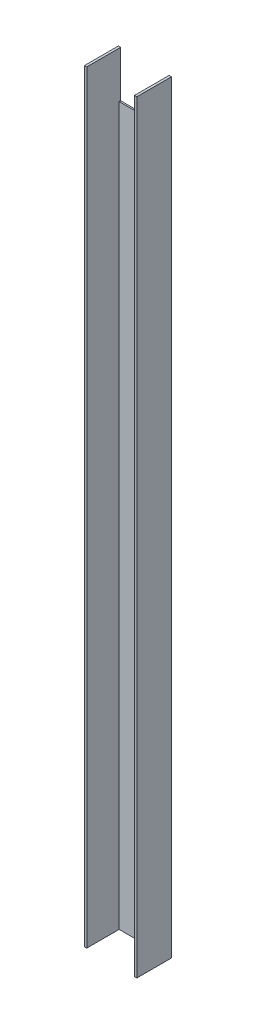
ISO-10303-21;
HEADER;
FILE_DESCRIPTION(('STEP AP214'),'2;1');
FILE_NAME('part.step','',(''),(''),'','','');
FILE_SCHEMA(('AUTOMOTIVE_DESIGN { 1 0 10303 214 1 1 1 1 }'));
ENDSEC;
DATA;
#1=APPLICATION_CONTEXT('core data for automotive mechanical design processes');
#2=APPLICATION_PROTOCOL_DEFINITION('international standard','automotive_design',2000,#1);
#3=PRODUCT_CONTEXT('',#1,'mechanical');
#4=PRODUCT('Part','Part','',(#3));
#5=PRODUCT_RELATED_PRODUCT_CATEGORY('part','',(#4));
#6=PRODUCT_DEFINITION_FORMATION('','',#4);
#7=PRODUCT_DEFINITION_CONTEXT('part definition',#1,'design');
#8=PRODUCT_DEFINITION('design','',#6,#7);
#9=PRODUCT_DEFINITION_SHAPE('','',#8);
#10=(LENGTH_UNIT() NAMED_UNIT(*) SI_UNIT(.MILLI.,.METRE.));
#11=(NAMED_UNIT(*) PLANE_ANGLE_UNIT() SI_UNIT($,.RADIAN.));
#12=(NAMED_UNIT(*) SI_UNIT($,.STERADIAN.) SOLID_ANGLE_UNIT());
#13=UNCERTAINTY_MEASURE_WITH_UNIT(LENGTH_MEASURE(1.E-05),#10,'distance_accuracy_value','');
#14=(GEOMETRIC_REPRESENTATION_CONTEXT(3) GLOBAL_UNCERTAINTY_ASSIGNED_CONTEXT((#13)) GLOBAL_UNIT_ASSIGNED_CONTEXT((#10,
#11,#12)) REPRESENTATION_CONTEXT('',''));
#15=CARTESIAN_POINT('',(0.,0.,0.));
#16=DIRECTION('',(0.,0.,1.));
#17=DIRECTION('',(1.,0.,0.));
#18=AXIS2_PLACEMENT_3D('',#15,#16,#17);
#19=CARTESIAN_POINT('',(0.,330.,0.));
#20=DIRECTION('',(0.,-1.,0.));
#21=DIRECTION('',(0.,0.,-1.));
#22=AXIS2_PLACEMENT_3D('',#19,#20,#21);
#23=PLANE('',#22);
#24=DIRECTION('',(0.,0.,-1.));
#25=VECTOR('',#24,1.);
#26=CARTESIAN_POINT('',(-10.3740289811574,330.,-6.7656710746679));
#27=LINE('',#26,#25);
#28=CARTESIAN_POINT('',(-10.3740289811574,330.,7.2343289253321));
#29=VERTEX_POINT('',#28);
#30=CARTESIAN_POINT('',(-10.3740289811574,330.,-7.41002070082675));
#31=VERTEX_POINT('',#30);
#32=EDGE_CURVE('E125',#29,#31,#27,.T.);
#33=ORIENTED_EDGE('',*,*,#32,.T.);
#34=DIRECTION('',(-1.,0.,0.));
#35=VECTOR('',#34,1.);
#36=CARTESIAN_POINT('',(-11.3620317412677,330.,-7.41002070082675));
#37=LINE('',#36,#35);
#38=CARTESIAN_POINT('',(-11.3620317412677,330.,-7.41002070082675));
#39=VERTEX_POINT('',#38);
#40=EDGE_CURVE('E102',#31,#39,#37,.T.);
#41=ORIENTED_EDGE('',*,*,#40,.T.);
#42=DIRECTION('',(0.,0.,1.));
#43=VECTOR('',#42,1.);
#44=CARTESIAN_POINT('',(-11.3620317412677,330.,7.2343289253321));
#45=LINE('',#44,#43);
#46=CARTESIAN_POINT('',(-11.3620317412677,330.,7.2343289253321));
#47=VERTEX_POINT('',#46);
#48=EDGE_CURVE('E204',#39,#47,#45,.T.);
#49=ORIENTED_EDGE('',*,*,#48,.T.);
#50=DIRECTION('',(1.,0.,0.));
#51=VECTOR('',#50,1.);
#52=CARTESIAN_POINT('',(-10.3740289811574,330.,7.2343289253321));
#53=LINE('',#52,#51);
#54=EDGE_CURVE('E188',#47,#29,#53,.T.);
#55=ORIENTED_EDGE('',*,*,#54,.T.);
#56=EDGE_LOOP('',(#33,#41,#49,#55));
#57=FACE_BOUND('',#56,.T.);
#58=ADVANCED_FACE('F39',(#57),#23,.F.);
#59=CARTESIAN_POINT('',(-11.3620317412677,330.,-7.41002070082675));
#60=DIRECTION('',(0.,0.,1.));
#61=DIRECTION('',(1.,0.,0.));
#62=AXIS2_PLACEMENT_3D('',#59,#60,#61);
#63=PLANE('',#62);
#64=ORIENTED_EDGE('',*,*,#40,.F.);
#65=DIRECTION('',(0.,1.,0.));
#66=VECTOR('',#65,1.);
#67=CARTESIAN_POINT('',(-10.3740289811574,310.,-7.41002070082675));
#68=LINE('',#67,#66);
#69=CARTESIAN_POINT('',(-10.3740289811574,310.,-7.41002070082675));
#70=VERTEX_POINT('',#69);
#71=EDGE_CURVE('E148',#70,#31,#68,.T.);
#72=ORIENTED_EDGE('',*,*,#71,.F.);
#73=DIRECTION('',(-1.,0.,0.));
#74=VECTOR('',#73,1.);
#75=CARTESIAN_POINT('',(-10.3740289811574,310.,-7.41002070082675));
#76=LINE('',#75,#74);
#77=CARTESIAN_POINT('',(10.6259710188426,310.,-7.41002070082675));
#78=VERTEX_POINT('',#77);
#79=EDGE_CURVE('E220',#78,#70,#76,.T.);
#80=ORIENTED_EDGE('',*,*,#79,.F.);
#81=DIRECTION('',(0.,1.,0.));
#82=VECTOR('',#81,1.);
#83=CARTESIAN_POINT('',(10.6259710188426,310.,-7.41002070082675));
#84=LINE('',#83,#82);
#85=CARTESIAN_POINT('',(10.6259710188426,330.,-7.41002070082675));
#86=VERTEX_POINT('',#85);
#87=EDGE_CURVE('E211',#78,#86,#84,.T.);
#88=ORIENTED_EDGE('',*,*,#87,.T.);
#89=CARTESIAN_POINT('',(11.6379682587323,330.,-7.41002070082675));
#90=VERTEX_POINT('',#89);
#91=EDGE_CURVE('E120',#90,#86,#37,.T.);
#92=ORIENTED_EDGE('',*,*,#91,.F.);
#93=DIRECTION('',(0.,-1.,0.));
#94=VECTOR('',#93,1.);
#95=CARTESIAN_POINT('',(11.6379682587323,330.,-7.41002070082675));
#96=LINE('',#95,#94);
#97=CARTESIAN_POINT('',(11.6379682587323,0.,-7.41002070082675));
#98=VERTEX_POINT('',#97);
#99=EDGE_CURVE('E139',#90,#98,#96,.T.);
#100=ORIENTED_EDGE('',*,*,#99,.T.);
#101=DIRECTION('',(-1.,0.,0.));
#102=VECTOR('',#101,1.);
#103=CARTESIAN_POINT('',(-11.3620317412677,0.,-7.41002070082675));
#104=LINE('',#103,#102);
#105=CARTESIAN_POINT('',(-11.3620317412677,0.,-7.41002070082675));
#106=VERTEX_POINT('',#105);
#107=EDGE_CURVE('E143',#98,#106,#104,.T.);
#108=ORIENTED_EDGE('',*,*,#107,.T.);
#109=DIRECTION('',(0.,-1.,0.));
#110=VECTOR('',#109,1.);
#111=CARTESIAN_POINT('',(-11.3620317412677,330.,-7.41002070082675));
#112=LINE('',#111,#110);
#113=EDGE_CURVE('E11',#39,#106,#112,.T.);
#114=ORIENTED_EDGE('',*,*,#113,.F.);
#115=EDGE_LOOP('',(#64,#72,#80,#88,#92,#100,#108,#114));
#116=FACE_BOUND('',#115,.T.);
#117=ADVANCED_FACE('F41',(#116),#63,.F.);
#118=CARTESIAN_POINT('',(-11.3620317412677,330.,7.2343289253321));
#119=DIRECTION('',(1.,0.,0.));
#120=DIRECTION('',(0.,0.,-1.));
#121=AXIS2_PLACEMENT_3D('',#118,#119,#120);
#122=PLANE('',#121);
#123=DIRECTION('',(0.,0.,1.));
#124=VECTOR('',#123,1.);
#125=CARTESIAN_POINT('',(-11.3620317412677,0.,7.2343289253321));
#126=LINE('',#125,#124);
#127=CARTESIAN_POINT('',(-11.3620317412677,0.,7.2343289253321));
#128=VERTEX_POINT('',#127);
#129=EDGE_CURVE('E147',#106,#128,#126,.T.);
#130=ORIENTED_EDGE('',*,*,#129,.T.);
#131=DIRECTION('',(0.,-1.,0.));
#132=VECTOR('',#131,1.);
#133=CARTESIAN_POINT('',(-11.3620317412677,330.,7.2343289253321));
#134=LINE('',#133,#132);
#135=EDGE_CURVE('E49',#47,#128,#134,.T.);
#136=ORIENTED_EDGE('',*,*,#135,.F.);
#137=ORIENTED_EDGE('',*,*,#48,.F.);
#138=ORIENTED_EDGE('',*,*,#113,.T.);
#139=EDGE_LOOP('',(#130,#136,#137,#138));
#140=FACE_BOUND('',#139,.T.);
#141=ADVANCED_FACE('F249',(#140),#122,.F.);
#142=CARTESIAN_POINT('',(-10.3740289811574,330.,7.2343289253321));
#143=DIRECTION('',(0.,0.,-1.));
#144=DIRECTION('',(-1.,0.,0.));
#145=AXIS2_PLACEMENT_3D('',#142,#143,#144);
#146=PLANE('',#145);
#147=DIRECTION('',(1.,0.,0.));
#148=VECTOR('',#147,1.);
#149=CARTESIAN_POINT('',(-10.3740289811574,0.,7.2343289253321));
#150=LINE('',#149,#148);
#151=CARTESIAN_POINT('',(-10.3740289811574,0.,7.2343289253321));
#152=VERTEX_POINT('',#151);
#153=EDGE_CURVE('E151',#128,#152,#150,.T.);
#154=ORIENTED_EDGE('',*,*,#153,.T.);
#155=DIRECTION('',(0.,-1.,0.));
#156=VECTOR('',#155,1.);
#157=CARTESIAN_POINT('',(-10.3740289811574,330.,7.2343289253321));
#158=LINE('',#157,#156);
#159=EDGE_CURVE('E177',#29,#152,#158,.T.);
#160=ORIENTED_EDGE('',*,*,#159,.F.);
#161=ORIENTED_EDGE('',*,*,#54,.F.);
#162=ORIENTED_EDGE('',*,*,#135,.T.);
#163=EDGE_LOOP('',(#154,#160,#161,#162));
#164=FACE_BOUND('',#163,.T.);
#165=ADVANCED_FACE('F186',(#164),#146,.F.);
#166=CARTESIAN_POINT('',(-10.3740289811574,330.,-6.7656710746679));
#167=DIRECTION('',(-1.,0.,0.));
#168=DIRECTION('',(0.,0.,1.));
#169=AXIS2_PLACEMENT_3D('',#166,#167,#168);
#170=PLANE('',#169);
#171=DIRECTION('',(0.,0.,-1.));
#172=VECTOR('',#171,1.);
#173=CARTESIAN_POINT('',(-10.3740289811574,0.,-6.7656710746679));
#174=LINE('',#173,#172);
#175=CARTESIAN_POINT('',(-10.3740289811574,0.,-6.7656710746679));
#176=VERTEX_POINT('',#175);
#177=EDGE_CURVE('E154',#152,#176,#174,.T.);
#178=ORIENTED_EDGE('',*,*,#177,.T.);
#179=DIRECTION('',(0.,-1.,0.));
#180=VECTOR('',#179,1.);
#181=CARTESIAN_POINT('',(-10.3740289811574,330.,-6.7656710746679));
#182=LINE('',#181,#180);
#183=CARTESIAN_POINT('',(-10.3740289811574,310.,-6.7656710746679));
#184=VERTEX_POINT('',#183);
#185=EDGE_CURVE('E174',#184,#176,#182,.T.);
#186=ORIENTED_EDGE('',*,*,#185,.F.);
#187=DIRECTION('',(0.,0.,1.));
#188=VECTOR('',#187,1.);
#189=CARTESIAN_POINT('',(-10.3740289811574,310.,-6.7656710746679));
#190=LINE('',#189,#188);
#191=EDGE_CURVE('E214',#70,#184,#190,.T.);
#192=ORIENTED_EDGE('',*,*,#191,.F.);
#193=ORIENTED_EDGE('',*,*,#71,.T.);
#194=ORIENTED_EDGE('',*,*,#32,.F.);
#195=ORIENTED_EDGE('',*,*,#159,.T.);
#196=EDGE_LOOP('',(#178,#186,#192,#193,#194,#195));
#197=FACE_BOUND('',#196,.T.);
#198=ADVANCED_FACE('F197',(#197),#170,.F.);
#199=CARTESIAN_POINT('',(10.6259710188426,330.,-6.7656710746679));
#200=DIRECTION('',(0.,0.,-1.));
#201=DIRECTION('',(-1.,0.,0.));
#202=AXIS2_PLACEMENT_3D('',#199,#200,#201);
#203=PLANE('',#202);
#204=DIRECTION('',(0.,-1.,0.));
#205=VECTOR('',#204,1.);
#206=CARTESIAN_POINT('',(10.6259710188426,330.,-6.7656710746679));
#207=LINE('',#206,#205);
#208=CARTESIAN_POINT('',(10.6259710188426,310.,-6.7656710746679));
#209=VERTEX_POINT('',#208);
#210=CARTESIAN_POINT('',(10.6259710188426,0.,-6.7656710746679));
#211=VERTEX_POINT('',#210);
#212=EDGE_CURVE('E132',#209,#211,#207,.T.);
#213=ORIENTED_EDGE('',*,*,#212,.F.);
#214=DIRECTION('',(1.,0.,0.));
#215=VECTOR('',#214,1.);
#216=CARTESIAN_POINT('',(10.6259710188426,310.,-6.7656710746679));
#217=LINE('',#216,#215);
#218=EDGE_CURVE('E228',#184,#209,#217,.T.);
#219=ORIENTED_EDGE('',*,*,#218,.F.);
#220=ORIENTED_EDGE('',*,*,#185,.T.);
#221=DIRECTION('',(1.,0.,0.));
#222=VECTOR('',#221,1.);
#223=CARTESIAN_POINT('',(10.6259710188426,0.,-6.7656710746679));
#224=LINE('',#223,#222);
#225=EDGE_CURVE('E158',#176,#211,#224,.T.);
#226=ORIENTED_EDGE('',*,*,#225,.T.);
#227=EDGE_LOOP('',(#213,#219,#220,#226));
#228=FACE_BOUND('',#227,.T.);
#229=ADVANCED_FACE('F241',(#228),#203,.F.);
#230=CARTESIAN_POINT('',(10.6259710188426,330.,7.58997929917325));
#231=DIRECTION('',(1.,0.,0.));
#232=DIRECTION('',(0.,0.,-1.));
#233=AXIS2_PLACEMENT_3D('',#230,#231,#232);
#234=PLANE('',#233);
#235=DIRECTION('',(0.,0.,1.));
#236=VECTOR('',#235,1.);
#237=CARTESIAN_POINT('',(10.6259710188426,0.,7.58997929917325));
#238=LINE('',#237,#236);
#239=CARTESIAN_POINT('',(10.6259710188426,0.,7.58997929917325));
#240=VERTEX_POINT('',#239);
#241=EDGE_CURVE('E130',#211,#240,#238,.T.);
#242=ORIENTED_EDGE('',*,*,#241,.T.);
#243=DIRECTION('',(0.,-1.,0.));
#244=VECTOR('',#243,1.);
#245=CARTESIAN_POINT('',(10.6259710188426,330.,7.58997929917325));
#246=LINE('',#245,#244);
#247=CARTESIAN_POINT('',(10.6259710188426,330.,7.58997929917325));
#248=VERTEX_POINT('',#247);
#249=EDGE_CURVE('E127',#248,#240,#246,.T.);
#250=ORIENTED_EDGE('',*,*,#249,.F.);
#251=DIRECTION('',(0.,0.,1.));
#252=VECTOR('',#251,1.);
#253=CARTESIAN_POINT('',(10.6259710188426,330.,7.58997929917325));
#254=LINE('',#253,#252);
#255=EDGE_CURVE('E113',#86,#248,#254,.T.);
#256=ORIENTED_EDGE('',*,*,#255,.F.);
#257=ORIENTED_EDGE('',*,*,#87,.F.);
#258=DIRECTION('',(0.,0.,-1.));
#259=VECTOR('',#258,1.);
#260=CARTESIAN_POINT('',(10.6259710188426,310.,-7.41002070082675));
#261=LINE('',#260,#259);
#262=EDGE_CURVE('E224',#209,#78,#261,.T.);
#263=ORIENTED_EDGE('',*,*,#262,.F.);
#264=ORIENTED_EDGE('',*,*,#212,.T.);
#265=EDGE_LOOP('',(#242,#250,#256,#257,#263,#264));
#266=FACE_BOUND('',#265,.T.);
#267=ADVANCED_FACE('F128',(#266),#234,.F.);
#268=CARTESIAN_POINT('',(11.6379682587323,330.,7.58997929917325));
#269=DIRECTION('',(0.,0.,-1.));
#270=DIRECTION('',(-1.,0.,0.));
#271=AXIS2_PLACEMENT_3D('',#268,#269,#270);
#272=PLANE('',#271);
#273=DIRECTION('',(1.,0.,0.));
#274=VECTOR('',#273,1.);
#275=CARTESIAN_POINT('',(11.6379682587323,0.,7.58997929917325));
#276=LINE('',#275,#274);
#277=CARTESIAN_POINT('',(11.6379682587323,0.,7.58997929917325));
#278=VERTEX_POINT('',#277);
#279=EDGE_CURVE('E87',#240,#278,#276,.T.);
#280=ORIENTED_EDGE('',*,*,#279,.T.);
#281=DIRECTION('',(0.,-1.,0.));
#282=VECTOR('',#281,1.);
#283=CARTESIAN_POINT('',(11.6379682587323,330.,7.58997929917325));
#284=LINE('',#283,#282);
#285=CARTESIAN_POINT('',(11.6379682587323,330.,7.58997929917325));
#286=VERTEX_POINT('',#285);
#287=EDGE_CURVE('E133',#286,#278,#284,.T.);
#288=ORIENTED_EDGE('',*,*,#287,.F.);
#289=DIRECTION('',(1.,0.,0.));
#290=VECTOR('',#289,1.);
#291=CARTESIAN_POINT('',(11.6379682587323,330.,7.58997929917325));
#292=LINE('',#291,#290);
#293=EDGE_CURVE('E117',#248,#286,#292,.T.);
#294=ORIENTED_EDGE('',*,*,#293,.F.);
#295=ORIENTED_EDGE('',*,*,#249,.T.);
#296=EDGE_LOOP('',(#280,#288,#294,#295));
#297=FACE_BOUND('',#296,.T.);
#298=ADVANCED_FACE('F135',(#297),#272,.F.);
#299=CARTESIAN_POINT('',(11.6379682587323,330.,-7.41002070082675));
#300=DIRECTION('',(-1.,0.,0.));
#301=DIRECTION('',(0.,0.,1.));
#302=AXIS2_PLACEMENT_3D('',#299,#300,#301);
#303=PLANE('',#302);
#304=DIRECTION('',(0.,0.,-1.));
#305=VECTOR('',#304,1.);
#306=CARTESIAN_POINT('',(11.6379682587323,0.,-7.41002070082675));
#307=LINE('',#306,#305);
#308=EDGE_CURVE('E93',#278,#98,#307,.T.);
#309=ORIENTED_EDGE('',*,*,#308,.T.);
#310=ORIENTED_EDGE('',*,*,#99,.F.);
#311=DIRECTION('',(0.,0.,-1.));
#312=VECTOR('',#311,1.);
#313=CARTESIAN_POINT('',(11.6379682587323,330.,-7.41002070082675));
#314=LINE('',#313,#312);
#315=EDGE_CURVE('E57',#286,#90,#314,.T.);
#316=ORIENTED_EDGE('',*,*,#315,.F.);
#317=ORIENTED_EDGE('',*,*,#287,.T.);
#318=EDGE_LOOP('',(#309,#310,#316,#317));
#319=FACE_BOUND('',#318,.T.);
#320=ADVANCED_FACE('F258',(#319),#303,.F.);
#321=ORIENTED_EDGE('',*,*,#91,.T.);
#322=ORIENTED_EDGE('',*,*,#255,.T.);
#323=ORIENTED_EDGE('',*,*,#293,.T.);
#324=ORIENTED_EDGE('',*,*,#315,.T.);
#325=EDGE_LOOP('',(#321,#322,#323,#324));
#326=FACE_BOUND('',#325,.T.);
#327=ADVANCED_FACE('F115',(#326),#23,.F.);
#328=CARTESIAN_POINT('',(0.,0.,0.));
#329=DIRECTION('',(0.,-1.,0.));
#330=DIRECTION('',(0.,0.,-1.));
#331=AXIS2_PLACEMENT_3D('',#328,#329,#330);
#332=PLANE('',#331);
#333=ORIENTED_EDGE('',*,*,#107,.F.);
#334=ORIENTED_EDGE('',*,*,#308,.F.);
#335=ORIENTED_EDGE('',*,*,#279,.F.);
#336=ORIENTED_EDGE('',*,*,#241,.F.);
#337=ORIENTED_EDGE('',*,*,#225,.F.);
#338=ORIENTED_EDGE('',*,*,#177,.F.);
#339=ORIENTED_EDGE('',*,*,#153,.F.);
#340=ORIENTED_EDGE('',*,*,#129,.F.);
#341=EDGE_LOOP('',(#333,#334,#335,#336,#337,#338,#339,#340));
#342=FACE_BOUND('',#341,.T.);
#343=ADVANCED_FACE('F193',(#342),#332,.T.);
#344=CARTESIAN_POINT('',(0.,310.,0.));
#345=DIRECTION('',(0.,-1.,0.));
#346=DIRECTION('',(0.,0.,-1.));
#347=AXIS2_PLACEMENT_3D('',#344,#345,#346);
#348=PLANE('',#347);
#349=ORIENTED_EDGE('',*,*,#218,.T.);
#350=ORIENTED_EDGE('',*,*,#262,.T.);
#351=ORIENTED_EDGE('',*,*,#79,.T.);
#352=ORIENTED_EDGE('',*,*,#191,.T.);
#353=EDGE_LOOP('',(#349,#350,#351,#352));
#354=FACE_BOUND('',#353,.T.);
#355=ADVANCED_FACE('F235',(#354),#348,.F.);
#356=CLOSED_SHELL('',(#58,#117,#141,#165,#198,#229,#267,#298,#320,#327,#343,#355));
#357=MANIFOLD_SOLID_BREP('B2',#356);
#358=ADVANCED_BREP_SHAPE_REPRESENTATION('',(#18,#357),#14);
#359=SHAPE_DEFINITION_REPRESENTATION(#9,#358);
ENDSEC;
END-ISO-10303-21;
